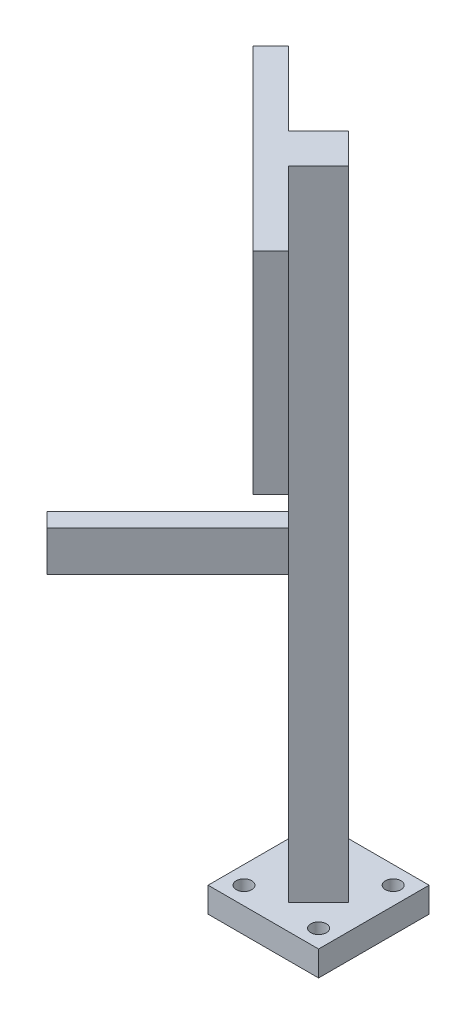
ISO-10303-21;
HEADER;
FILE_DESCRIPTION(('STEP AP214'),'2;1');
FILE_NAME('part.step','',(''),(''),'','','');
FILE_SCHEMA(('AUTOMOTIVE_DESIGN { 1 0 10303 214 1 1 1 1 }'));
ENDSEC;
DATA;
#1=APPLICATION_CONTEXT('core data for automotive mechanical design processes');
#2=APPLICATION_PROTOCOL_DEFINITION('international standard','automotive_design',2000,#1);
#3=PRODUCT_CONTEXT('',#1,'mechanical');
#4=PRODUCT('Part','Part','',(#3));
#5=PRODUCT_RELATED_PRODUCT_CATEGORY('part','',(#4));
#6=PRODUCT_DEFINITION_FORMATION('','',#4);
#7=PRODUCT_DEFINITION_CONTEXT('part definition',#1,'design');
#8=PRODUCT_DEFINITION('design','',#6,#7);
#9=PRODUCT_DEFINITION_SHAPE('','',#8);
#10=(LENGTH_UNIT() NAMED_UNIT(*) SI_UNIT(.MILLI.,.METRE.));
#11=(NAMED_UNIT(*) PLANE_ANGLE_UNIT() SI_UNIT($,.RADIAN.));
#12=(NAMED_UNIT(*) SI_UNIT($,.STERADIAN.) SOLID_ANGLE_UNIT());
#13=UNCERTAINTY_MEASURE_WITH_UNIT(LENGTH_MEASURE(1.E-05),#10,'distance_accuracy_value','');
#14=(GEOMETRIC_REPRESENTATION_CONTEXT(3) GLOBAL_UNCERTAINTY_ASSIGNED_CONTEXT((#13)) GLOBAL_UNIT_ASSIGNED_CONTEXT((#10,
#11,#12)) REPRESENTATION_CONTEXT('',''));
#15=CARTESIAN_POINT('',(0.,0.,0.));
#16=DIRECTION('',(0.,0.,1.));
#17=DIRECTION('',(1.,0.,0.));
#18=AXIS2_PLACEMENT_3D('',#15,#16,#17);
#19=CARTESIAN_POINT('',(-5.99999999999986,132.,0.));
#20=DIRECTION('',(0.70710678118655,0.,-0.707106781186545));
#21=DIRECTION('',(-0.707106781186545,0.,-0.70710678118655));
#22=AXIS2_PLACEMENT_3D('',#19,#20,#21);
#23=PLANE('',#22);
#24=DIRECTION('',(0.,-1.,0.));
#25=VECTOR('',#24,1.);
#26=CARTESIAN_POINT('',(-4.41421356237302,60.,1.58578643762682));
#27=LINE('',#26,#25);
#28=CARTESIAN_POINT('',(-4.41421356237302,68.,1.58578643762682));
#29=VERTEX_POINT('',#28);
#30=CARTESIAN_POINT('',(-4.41421356237302,60.,1.58578643762682));
#31=VERTEX_POINT('',#30);
#32=EDGE_CURVE('E307',#29,#31,#27,.T.);
#33=ORIENTED_EDGE('',*,*,#32,.F.);
#34=DIRECTION('',(-0.707106781186545,0.,-0.70710678118655));
#35=VECTOR('',#34,1.);
#36=CARTESIAN_POINT('',(-4.41421356237302,68.,1.58578643762682));
#37=LINE('',#36,#35);
#38=CARTESIAN_POINT('',(-1.58578643762684,68.,4.41421356237302));
#39=VERTEX_POINT('',#38);
#40=EDGE_CURVE('E312',#39,#29,#37,.T.);
#41=ORIENTED_EDGE('',*,*,#40,.F.);
#42=DIRECTION('',(0.,1.,0.));
#43=VECTOR('',#42,1.);
#44=CARTESIAN_POINT('',(-1.58578643762684,68.,4.41421356237302));
#45=LINE('',#44,#43);
#46=CARTESIAN_POINT('',(-1.58578643762684,60.,4.41421356237302));
#47=VERTEX_POINT('',#46);
#48=EDGE_CURVE('E324',#47,#39,#45,.T.);
#49=ORIENTED_EDGE('',*,*,#48,.F.);
#50=DIRECTION('',(0.707106781186545,0.,0.70710678118655));
#51=VECTOR('',#50,1.);
#52=CARTESIAN_POINT('',(-1.58578643762684,60.,4.41421356237302));
#53=LINE('',#52,#51);
#54=EDGE_CURVE('E321',#31,#47,#53,.T.);
#55=ORIENTED_EDGE('',*,*,#54,.F.);
#56=EDGE_LOOP('',(#33,#41,#49,#55));
#57=FACE_BOUND('',#56,.T.);
#58=DIRECTION('',(0.707106781186545,0.,0.70710678118655));
#59=VECTOR('',#58,1.);
#60=CARTESIAN_POINT('',(14.6776695296637,90.,20.6776695296636));
#61=LINE('',#60,#59);
#62=CARTESIAN_POINT('',(-5.99999999999985,90.,0.));
#63=VERTEX_POINT('',#62);
#64=CARTESIAN_POINT('',(1.28369537222284E-13,90.,6.));
#65=VERTEX_POINT('',#64);
#66=EDGE_CURVE('E292',#63,#65,#61,.T.);
#67=ORIENTED_EDGE('',*,*,#66,.F.);
#68=DIRECTION('',(0.,-1.,0.));
#69=VECTOR('',#68,1.);
#70=CARTESIAN_POINT('',(-5.99999999999986,132.,0.));
#71=LINE('',#70,#69);
#72=CARTESIAN_POINT('',(-5.99999999999986,5.,0.));
#73=VERTEX_POINT('',#72);
#74=EDGE_CURVE('E367',#63,#73,#71,.T.);
#75=ORIENTED_EDGE('',*,*,#74,.T.);
#76=DIRECTION('',(0.707106781186545,0.,0.70710678118655));
#77=VECTOR('',#76,1.);
#78=CARTESIAN_POINT('',(-5.99999999999986,5.,0.));
#79=LINE('',#78,#77);
#80=CARTESIAN_POINT('',(1.23625527121837E-13,5.,6.));
#81=VERTEX_POINT('',#80);
#82=EDGE_CURVE('E356',#73,#81,#79,.T.);
#83=ORIENTED_EDGE('',*,*,#82,.T.);
#84=DIRECTION('',(0.,-1.,0.));
#85=VECTOR('',#84,1.);
#86=CARTESIAN_POINT('',(1.23625527121837E-13,132.,6.));
#87=LINE('',#86,#85);
#88=EDGE_CURVE('E363',#65,#81,#87,.T.);
#89=ORIENTED_EDGE('',*,*,#88,.F.);
#90=EDGE_LOOP('',(#67,#75,#83,#89));
#91=FACE_BOUND('',#90,.T.);
#92=ADVANCED_FACE('F36',(#57,#91),#23,.F.);
#93=CARTESIAN_POINT('',(0.,5.,0.));
#94=DIRECTION('',(0.,1.,0.));
#95=DIRECTION('',(0.,0.,1.));
#96=AXIS2_PLACEMENT_3D('',#93,#94,#95);
#97=PLANE('',#96);
#98=DIRECTION('',(-0.707106781186545,0.,-0.70710678118655));
#99=VECTOR('',#98,1.);
#100=CARTESIAN_POINT('',(6.00000000000014,5.,0.));
#101=LINE('',#100,#99);
#102=CARTESIAN_POINT('',(6.00000000000014,5.,0.));
#103=VERTEX_POINT('',#102);
#104=CARTESIAN_POINT('',(1.65523303187956E-13,5.,-6.));
#105=VERTEX_POINT('',#104);
#106=EDGE_CURVE('E340',#103,#105,#101,.T.);
#107=ORIENTED_EDGE('',*,*,#106,.F.);
#108=DIRECTION('',(0.70710678118655,0.,-0.707106781186545));
#109=VECTOR('',#108,1.);
#110=CARTESIAN_POINT('',(1.23625527121837E-13,5.,6.));
#111=LINE('',#110,#109);
#112=EDGE_CURVE('E345',#81,#103,#111,.T.);
#113=ORIENTED_EDGE('',*,*,#112,.F.);
#114=ORIENTED_EDGE('',*,*,#82,.F.);
#115=DIRECTION('',(-0.70710678118655,0.,0.707106781186545));
#116=VECTOR('',#115,1.);
#117=CARTESIAN_POINT('',(1.65523303187956E-13,5.,-6.));
#118=LINE('',#117,#116);
#119=EDGE_CURVE('E353',#105,#73,#118,.T.);
#120=ORIENTED_EDGE('',*,*,#119,.F.);
#121=EDGE_LOOP('',(#107,#113,#114,#120));
#122=FACE_BOUND('',#121,.T.);
#123=CARTESIAN_POINT('',(7.42462120245917,5.,7.42462120245833));
#124=DIRECTION('',(0.,1.,0.));
#125=DIRECTION('',(0.,0.,1.));
#126=AXIS2_PLACEMENT_3D('',#123,#124,#125);
#127=CIRCLE('',#126,1.55000000000059);
#128=CARTESIAN_POINT('',(7.42462120245917,5.,8.97462120245892));
#129=VERTEX_POINT('',#128);
#130=EDGE_CURVE('E380',#129,#129,#127,.T.);
#131=ORIENTED_EDGE('',*,*,#130,.F.);
#132=EDGE_LOOP('',(#131));
#133=FACE_BOUND('',#132,.T.);
#134=CARTESIAN_POINT('',(-7.42462120245875,5.,-7.42462120245875));
#135=DIRECTION('',(0.,1.,0.));
#136=DIRECTION('',(0.,0.,1.));
#137=AXIS2_PLACEMENT_3D('',#134,#135,#136);
#138=CIRCLE('',#137,1.55);
#139=CARTESIAN_POINT('',(-7.42462120245875,5.,-5.87462120245875));
#140=VERTEX_POINT('',#139);
#141=EDGE_CURVE('E392',#140,#140,#138,.T.);
#142=ORIENTED_EDGE('',*,*,#141,.F.);
#143=EDGE_LOOP('',(#142));
#144=FACE_BOUND('',#143,.T.);
#145=DIRECTION('',(0.,0.,-1.));
#146=VECTOR('',#145,1.);
#147=CARTESIAN_POINT('',(11.,5.,-11.));
#148=LINE('',#147,#146);
#149=CARTESIAN_POINT('',(11.,5.,11.));
#150=VERTEX_POINT('',#149);
#151=CARTESIAN_POINT('',(11.,5.,-11.));
#152=VERTEX_POINT('',#151);
#153=EDGE_CURVE('E398',#150,#152,#148,.T.);
#154=ORIENTED_EDGE('',*,*,#153,.T.);
#155=DIRECTION('',(-1.,0.,0.));
#156=VECTOR('',#155,1.);
#157=CARTESIAN_POINT('',(-11.,5.,-11.));
#158=LINE('',#157,#156);
#159=CARTESIAN_POINT('',(-11.,5.,-11.));
#160=VERTEX_POINT('',#159);
#161=EDGE_CURVE('E401',#152,#160,#158,.T.);
#162=ORIENTED_EDGE('',*,*,#161,.T.);
#163=DIRECTION('',(0.,0.,1.));
#164=VECTOR('',#163,1.);
#165=CARTESIAN_POINT('',(-11.,5.,-11.));
#166=LINE('',#165,#164);
#167=CARTESIAN_POINT('',(-11.,5.,11.));
#168=VERTEX_POINT('',#167);
#169=EDGE_CURVE('E404',#160,#168,#166,.T.);
#170=ORIENTED_EDGE('',*,*,#169,.T.);
#171=DIRECTION('',(1.,0.,0.));
#172=VECTOR('',#171,1.);
#173=CARTESIAN_POINT('',(-11.,5.,11.));
#174=LINE('',#173,#172);
#175=EDGE_CURVE('E406',#168,#150,#174,.T.);
#176=ORIENTED_EDGE('',*,*,#175,.T.);
#177=EDGE_LOOP('',(#154,#162,#170,#176));
#178=FACE_BOUND('',#177,.T.);
#179=CARTESIAN_POINT('',(7.42462120245875,5.,-7.42462120245917));
#180=DIRECTION('',(0.,1.,0.));
#181=DIRECTION('',(0.,0.,1.));
#182=AXIS2_PLACEMENT_3D('',#179,#180,#181);
#183=CIRCLE('',#182,1.55000000000044);
#184=CARTESIAN_POINT('',(7.42462120245875,5.,-5.87462120245873));
#185=VERTEX_POINT('',#184);
#186=EDGE_CURVE('E386',#185,#185,#183,.T.);
#187=ORIENTED_EDGE('',*,*,#186,.F.);
#188=EDGE_LOOP('',(#187));
#189=FACE_BOUND('',#188,.T.);
#190=CARTESIAN_POINT('',(-7.42462120245833,5.,7.42462120245875));
#191=DIRECTION('',(0.,1.,0.));
#192=DIRECTION('',(0.,0.,1.));
#193=AXIS2_PLACEMENT_3D('',#190,#191,#192);
#194=CIRCLE('',#193,1.55000000000023);
#195=CARTESIAN_POINT('',(-7.42462120245833,5.,8.97462120245898));
#196=VERTEX_POINT('',#195);
#197=EDGE_CURVE('E374',#196,#196,#194,.T.);
#198=ORIENTED_EDGE('',*,*,#197,.F.);
#199=EDGE_LOOP('',(#198));
#200=FACE_BOUND('',#199,.T.);
#201=ADVANCED_FACE('F441',(#122,#133,#144,#178,#189,#200),#97,.T.);
#202=CARTESIAN_POINT('',(0.,0.,0.));
#203=DIRECTION('',(0.,1.,0.));
#204=DIRECTION('',(0.,0.,1.));
#205=AXIS2_PLACEMENT_3D('',#202,#203,#204);
#206=PLANE('',#205);
#207=DIRECTION('',(0.,0.,-1.));
#208=VECTOR('',#207,1.);
#209=CARTESIAN_POINT('',(11.,0.,-11.));
#210=LINE('',#209,#208);
#211=CARTESIAN_POINT('',(11.,0.,11.));
#212=VERTEX_POINT('',#211);
#213=CARTESIAN_POINT('',(11.,0.,-11.));
#214=VERTEX_POINT('',#213);
#215=EDGE_CURVE('E395',#212,#214,#210,.T.);
#216=ORIENTED_EDGE('',*,*,#215,.F.);
#217=DIRECTION('',(1.,0.,0.));
#218=VECTOR('',#217,1.);
#219=CARTESIAN_POINT('',(-11.,0.,11.));
#220=LINE('',#219,#218);
#221=CARTESIAN_POINT('',(-11.,0.,11.));
#222=VERTEX_POINT('',#221);
#223=EDGE_CURVE('E402',#222,#212,#220,.T.);
#224=ORIENTED_EDGE('',*,*,#223,.F.);
#225=DIRECTION('',(0.,0.,1.));
#226=VECTOR('',#225,1.);
#227=CARTESIAN_POINT('',(-11.,0.,-11.));
#228=LINE('',#227,#226);
#229=CARTESIAN_POINT('',(-11.,0.,-11.));
#230=VERTEX_POINT('',#229);
#231=EDGE_CURVE('E413',#230,#222,#228,.T.);
#232=ORIENTED_EDGE('',*,*,#231,.F.);
#233=DIRECTION('',(-1.,0.,0.));
#234=VECTOR('',#233,1.);
#235=CARTESIAN_POINT('',(-11.,0.,-11.));
#236=LINE('',#235,#234);
#237=EDGE_CURVE('E411',#214,#230,#236,.T.);
#238=ORIENTED_EDGE('',*,*,#237,.F.);
#239=EDGE_LOOP('',(#216,#224,#232,#238));
#240=FACE_BOUND('',#239,.T.);
#241=CARTESIAN_POINT('',(-7.42462120245875,0.,-7.42462120245875));
#242=DIRECTION('',(0.,1.,0.));
#243=DIRECTION('',(0.,0.,1.));
#244=AXIS2_PLACEMENT_3D('',#241,#242,#243);
#245=CIRCLE('',#244,1.55);
#246=CARTESIAN_POINT('',(-7.42462120245875,0.,-5.87462120245875));
#247=VERTEX_POINT('',#246);
#248=EDGE_CURVE('E389',#247,#247,#245,.T.);
#249=ORIENTED_EDGE('',*,*,#248,.T.);
#250=EDGE_LOOP('',(#249));
#251=FACE_BOUND('',#250,.T.);
#252=CARTESIAN_POINT('',(7.42462120245875,0.,-7.42462120245917));
#253=DIRECTION('',(0.,1.,0.));
#254=DIRECTION('',(0.,0.,1.));
#255=AXIS2_PLACEMENT_3D('',#252,#253,#254);
#256=CIRCLE('',#255,1.55000000000044);
#257=CARTESIAN_POINT('',(7.42462120245875,0.,-5.87462120245873));
#258=VERTEX_POINT('',#257);
#259=EDGE_CURVE('E383',#258,#258,#256,.T.);
#260=ORIENTED_EDGE('',*,*,#259,.T.);
#261=EDGE_LOOP('',(#260));
#262=FACE_BOUND('',#261,.T.);
#263=CARTESIAN_POINT('',(7.42462120245917,0.,7.42462120245833));
#264=DIRECTION('',(0.,1.,0.));
#265=DIRECTION('',(0.,0.,1.));
#266=AXIS2_PLACEMENT_3D('',#263,#264,#265);
#267=CIRCLE('',#266,1.55000000000059);
#268=CARTESIAN_POINT('',(7.42462120245917,0.,8.97462120245892));
#269=VERTEX_POINT('',#268);
#270=EDGE_CURVE('E377',#269,#269,#267,.T.);
#271=ORIENTED_EDGE('',*,*,#270,.T.);
#272=EDGE_LOOP('',(#271));
#273=FACE_BOUND('',#272,.T.);
#274=CARTESIAN_POINT('',(-7.42462120245833,0.,7.42462120245875));
#275=DIRECTION('',(0.,1.,0.));
#276=DIRECTION('',(0.,0.,1.));
#277=AXIS2_PLACEMENT_3D('',#274,#275,#276);
#278=CIRCLE('',#277,1.55000000000023);
#279=CARTESIAN_POINT('',(-7.42462120245833,0.,8.97462120245898));
#280=VERTEX_POINT('',#279);
#281=EDGE_CURVE('E373',#280,#280,#278,.T.);
#282=ORIENTED_EDGE('',*,*,#281,.T.);
#283=EDGE_LOOP('',(#282));
#284=FACE_BOUND('',#283,.T.);
#285=ADVANCED_FACE('F431',(#240,#251,#262,#273,#284),#206,.F.);
#286=CARTESIAN_POINT('',(11.,5.,-11.));
#287=DIRECTION('',(-1.,0.,0.));
#288=DIRECTION('',(0.,0.,1.));
#289=AXIS2_PLACEMENT_3D('',#286,#287,#288);
#290=PLANE('',#289);
#291=ORIENTED_EDGE('',*,*,#215,.T.);
#292=DIRECTION('',(0.,-1.,0.));
#293=VECTOR('',#292,1.);
#294=CARTESIAN_POINT('',(11.,5.,-11.));
#295=LINE('',#294,#293);
#296=EDGE_CURVE('E11',#152,#214,#295,.T.);
#297=ORIENTED_EDGE('',*,*,#296,.F.);
#298=ORIENTED_EDGE('',*,*,#153,.F.);
#299=DIRECTION('',(0.,-1.,0.));
#300=VECTOR('',#299,1.);
#301=CARTESIAN_POINT('',(11.,5.,11.));
#302=LINE('',#301,#300);
#303=EDGE_CURVE('E408',#150,#212,#302,.T.);
#304=ORIENTED_EDGE('',*,*,#303,.T.);
#305=EDGE_LOOP('',(#291,#297,#298,#304));
#306=FACE_BOUND('',#305,.T.);
#307=ADVANCED_FACE('F38',(#306),#290,.F.);
#308=CARTESIAN_POINT('',(-11.,5.,-11.));
#309=DIRECTION('',(0.,0.,1.));
#310=DIRECTION('',(1.,0.,0.));
#311=AXIS2_PLACEMENT_3D('',#308,#309,#310);
#312=PLANE('',#311);
#313=ORIENTED_EDGE('',*,*,#237,.T.);
#314=DIRECTION('',(0.,-1.,0.));
#315=VECTOR('',#314,1.);
#316=CARTESIAN_POINT('',(-11.,5.,-11.));
#317=LINE('',#316,#315);
#318=EDGE_CURVE('E44',#160,#230,#317,.T.);
#319=ORIENTED_EDGE('',*,*,#318,.F.);
#320=ORIENTED_EDGE('',*,*,#161,.F.);
#321=ORIENTED_EDGE('',*,*,#296,.T.);
#322=EDGE_LOOP('',(#313,#319,#320,#321));
#323=FACE_BOUND('',#322,.T.);
#324=ADVANCED_FACE('F443',(#323),#312,.F.);
#325=CARTESIAN_POINT('',(-11.,5.,-11.));
#326=DIRECTION('',(1.,0.,0.));
#327=DIRECTION('',(0.,0.,-1.));
#328=AXIS2_PLACEMENT_3D('',#325,#326,#327);
#329=PLANE('',#328);
#330=ORIENTED_EDGE('',*,*,#231,.T.);
#331=DIRECTION('',(0.,-1.,0.));
#332=VECTOR('',#331,1.);
#333=CARTESIAN_POINT('',(-11.,5.,11.));
#334=LINE('',#333,#332);
#335=EDGE_CURVE('E418',#168,#222,#334,.T.);
#336=ORIENTED_EDGE('',*,*,#335,.F.);
#337=ORIENTED_EDGE('',*,*,#169,.F.);
#338=ORIENTED_EDGE('',*,*,#318,.T.);
#339=EDGE_LOOP('',(#330,#336,#337,#338));
#340=FACE_BOUND('',#339,.T.);
#341=ADVANCED_FACE('F425',(#340),#329,.F.);
#342=CARTESIAN_POINT('',(-11.,5.,11.));
#343=DIRECTION('',(0.,0.,-1.));
#344=DIRECTION('',(-1.,0.,0.));
#345=AXIS2_PLACEMENT_3D('',#342,#343,#344);
#346=PLANE('',#345);
#347=ORIENTED_EDGE('',*,*,#223,.T.);
#348=ORIENTED_EDGE('',*,*,#303,.F.);
#349=ORIENTED_EDGE('',*,*,#175,.F.);
#350=ORIENTED_EDGE('',*,*,#335,.T.);
#351=EDGE_LOOP('',(#347,#348,#349,#350));
#352=FACE_BOUND('',#351,.T.);
#353=ADVANCED_FACE('F435',(#352),#346,.F.);
#354=CARTESIAN_POINT('',(-7.42462120245875,5.,-7.42462120245875));
#355=DIRECTION('',(0.,-1.,0.));
#356=DIRECTION('',(0.,0.,-1.));
#357=AXIS2_PLACEMENT_3D('',#354,#355,#356);
#358=CYLINDRICAL_SURFACE('',#357,1.55);
#359=ORIENTED_EDGE('',*,*,#141,.T.);
#360=EDGE_LOOP('',(#359));
#361=FACE_BOUND('',#360,.T.);
#362=ORIENTED_EDGE('',*,*,#248,.F.);
#363=EDGE_LOOP('',(#362));
#364=FACE_BOUND('',#363,.T.);
#365=ADVANCED_FACE('F482',(#361,#364),#358,.F.);
#366=CARTESIAN_POINT('',(7.42462120245875,5.,-7.42462120245917));
#367=DIRECTION('',(0.,-1.,0.));
#368=DIRECTION('',(0.,0.,-1.));
#369=AXIS2_PLACEMENT_3D('',#366,#367,#368);
#370=CYLINDRICAL_SURFACE('',#369,1.55000000000044);
#371=ORIENTED_EDGE('',*,*,#186,.T.);
#372=EDGE_LOOP('',(#371));
#373=FACE_BOUND('',#372,.T.);
#374=ORIENTED_EDGE('',*,*,#259,.F.);
#375=EDGE_LOOP('',(#374));
#376=FACE_BOUND('',#375,.T.);
#377=ADVANCED_FACE('F478',(#373,#376),#370,.F.);
#378=CARTESIAN_POINT('',(7.42462120245917,5.,7.42462120245833));
#379=DIRECTION('',(0.,-1.,0.));
#380=DIRECTION('',(0.,0.,-1.));
#381=AXIS2_PLACEMENT_3D('',#378,#379,#380);
#382=CYLINDRICAL_SURFACE('',#381,1.55000000000059);
#383=ORIENTED_EDGE('',*,*,#130,.T.);
#384=EDGE_LOOP('',(#383));
#385=FACE_BOUND('',#384,.T.);
#386=ORIENTED_EDGE('',*,*,#270,.F.);
#387=EDGE_LOOP('',(#386));
#388=FACE_BOUND('',#387,.T.);
#389=ADVANCED_FACE('F474',(#385,#388),#382,.F.);
#390=CARTESIAN_POINT('',(-7.42462120245833,5.,7.42462120245875));
#391=DIRECTION('',(0.,-1.,0.));
#392=DIRECTION('',(0.,0.,-1.));
#393=AXIS2_PLACEMENT_3D('',#390,#391,#392);
#394=CYLINDRICAL_SURFACE('',#393,1.55000000000023);
#395=ORIENTED_EDGE('',*,*,#197,.T.);
#396=EDGE_LOOP('',(#395));
#397=FACE_BOUND('',#396,.T.);
#398=ORIENTED_EDGE('',*,*,#281,.F.);
#399=EDGE_LOOP('',(#398));
#400=FACE_BOUND('',#399,.T.);
#401=ADVANCED_FACE('F470',(#397,#400),#394,.F.);
#402=CARTESIAN_POINT('',(6.00000000000014,132.,0.));
#403=DIRECTION('',(-0.70710678118655,0.,0.707106781186545));
#404=DIRECTION('',(0.707106781186545,0.,0.70710678118655));
#405=AXIS2_PLACEMENT_3D('',#402,#403,#404);
#406=PLANE('',#405);
#407=ORIENTED_EDGE('',*,*,#106,.T.);
#408=DIRECTION('',(0.,-1.,0.));
#409=VECTOR('',#408,1.);
#410=CARTESIAN_POINT('',(1.65523303187956E-13,132.,-6.));
#411=LINE('',#410,#409);
#412=CARTESIAN_POINT('',(1.65523303187956E-13,132.,-6.));
#413=VERTEX_POINT('',#412);
#414=EDGE_CURVE('E370',#413,#105,#411,.T.);
#415=ORIENTED_EDGE('',*,*,#414,.F.);
#416=DIRECTION('',(-0.707106781186545,0.,-0.70710678118655));
#417=VECTOR('',#416,1.);
#418=CARTESIAN_POINT('',(6.00000000000014,132.,0.));
#419=LINE('',#418,#417);
#420=CARTESIAN_POINT('',(6.00000000000014,132.,0.));
#421=VERTEX_POINT('',#420);
#422=EDGE_CURVE('E341',#421,#413,#419,.T.);
#423=ORIENTED_EDGE('',*,*,#422,.F.);
#424=DIRECTION('',(0.,-1.,0.));
#425=VECTOR('',#424,1.);
#426=CARTESIAN_POINT('',(6.00000000000014,132.,0.));
#427=LINE('',#426,#425);
#428=EDGE_CURVE('E350',#421,#103,#427,.T.);
#429=ORIENTED_EDGE('',*,*,#428,.T.);
#430=EDGE_LOOP('',(#407,#415,#423,#429));
#431=FACE_BOUND('',#430,.T.);
#432=ADVANCED_FACE('F466',(#431),#406,.F.);
#433=CARTESIAN_POINT('',(1.65523303187956E-13,132.,-6.));
#434=DIRECTION('',(0.707106781186545,0.,0.70710678118655));
#435=DIRECTION('',(0.70710678118655,0.,-0.707106781186545));
#436=AXIS2_PLACEMENT_3D('',#433,#434,#435);
#437=PLANE('',#436);
#438=ORIENTED_EDGE('',*,*,#119,.T.);
#439=ORIENTED_EDGE('',*,*,#74,.F.);
#440=CARTESIAN_POINT('',(-5.99999999999986,132.,0.));
#441=VERTEX_POINT('',#440);
#442=EDGE_CURVE('E368',#441,#63,#71,.T.);
#443=ORIENTED_EDGE('',*,*,#442,.F.);
#444=DIRECTION('',(-0.70710678118655,0.,0.707106781186545));
#445=VECTOR('',#444,1.);
#446=CARTESIAN_POINT('',(1.65523303187956E-13,132.,-6.));
#447=LINE('',#446,#445);
#448=EDGE_CURVE('E344',#413,#441,#447,.T.);
#449=ORIENTED_EDGE('',*,*,#448,.F.);
#450=ORIENTED_EDGE('',*,*,#414,.T.);
#451=EDGE_LOOP('',(#438,#439,#443,#449,#450));
#452=FACE_BOUND('',#451,.T.);
#453=ADVANCED_FACE('F463',(#452),#437,.F.);
#454=CARTESIAN_POINT('',(1.23625527121837E-13,132.,6.));
#455=DIRECTION('',(-0.707106781186545,0.,-0.70710678118655));
#456=DIRECTION('',(-0.70710678118655,0.,0.707106781186545));
#457=AXIS2_PLACEMENT_3D('',#454,#455,#456);
#458=PLANE('',#457);
#459=ORIENTED_EDGE('',*,*,#112,.T.);
#460=ORIENTED_EDGE('',*,*,#428,.F.);
#461=DIRECTION('',(0.70710678118655,0.,-0.707106781186545));
#462=VECTOR('',#461,1.);
#463=CARTESIAN_POINT('',(1.23625527121837E-13,132.,6.));
#464=LINE('',#463,#462);
#465=CARTESIAN_POINT('',(1.23625527121837E-13,132.,6.));
#466=VERTEX_POINT('',#465);
#467=EDGE_CURVE('E348',#466,#421,#464,.T.);
#468=ORIENTED_EDGE('',*,*,#467,.F.);
#469=EDGE_CURVE('E364',#466,#65,#87,.T.);
#470=ORIENTED_EDGE('',*,*,#469,.T.);
#471=ORIENTED_EDGE('',*,*,#88,.T.);
#472=EDGE_LOOP('',(#459,#460,#468,#470,#471));
#473=FACE_BOUND('',#472,.T.);
#474=ADVANCED_FACE('F461',(#473),#458,.F.);
#475=CARTESIAN_POINT('',(0.,132.,0.));
#476=DIRECTION('',(0.,1.,0.));
#477=DIRECTION('',(0.,0.,1.));
#478=AXIS2_PLACEMENT_3D('',#475,#476,#477);
#479=PLANE('',#478);
#480=ORIENTED_EDGE('',*,*,#422,.T.);
#481=ORIENTED_EDGE('',*,*,#448,.T.);
#482=DIRECTION('',(-0.707106781186545,0.,-0.70710678118655));
#483=VECTOR('',#482,1.);
#484=CARTESIAN_POINT('',(1.24466409401336E-13,132.,6.));
#485=LINE('',#484,#483);
#486=CARTESIAN_POINT('',(-20.6776695296636,132.,-14.6776695296638));
#487=VERTEX_POINT('',#486);
#488=EDGE_CURVE('E294',#441,#487,#485,.T.);
#489=ORIENTED_EDGE('',*,*,#488,.T.);
#490=DIRECTION('',(0.70710678118655,0.,-0.707106781186545));
#491=VECTOR('',#490,1.);
#492=CARTESIAN_POINT('',(-24.2132034355963,132.,-11.1421356237311));
#493=LINE('',#492,#491);
#494=CARTESIAN_POINT('',(-24.2132034355963,132.,-11.1421356237311));
#495=VERTEX_POINT('',#494);
#496=EDGE_CURVE('E304',#495,#487,#493,.T.);
#497=ORIENTED_EDGE('',*,*,#496,.F.);
#498=DIRECTION('',(-0.707106781186545,0.,-0.70710678118655));
#499=VECTOR('',#498,1.);
#500=CARTESIAN_POINT('',(-24.2132034355963,132.,-11.1421356237311));
#501=LINE('',#500,#499);
#502=CARTESIAN_POINT('',(11.1421356237309,132.,24.2132034355964));
#503=VERTEX_POINT('',#502);
#504=EDGE_CURVE('E274',#503,#495,#501,.T.);
#505=ORIENTED_EDGE('',*,*,#504,.F.);
#506=DIRECTION('',(0.70710678118655,0.,-0.707106781186545));
#507=VECTOR('',#506,1.);
#508=CARTESIAN_POINT('',(11.1421356237309,132.,24.2132034355964));
#509=LINE('',#508,#507);
#510=CARTESIAN_POINT('',(14.6776695296637,132.,20.6776695296637));
#511=VERTEX_POINT('',#510);
#512=EDGE_CURVE('E285',#503,#511,#509,.T.);
#513=ORIENTED_EDGE('',*,*,#512,.T.);
#514=EDGE_CURVE('E278',#511,#466,#485,.T.);
#515=ORIENTED_EDGE('',*,*,#514,.T.);
#516=ORIENTED_EDGE('',*,*,#467,.T.);
#517=EDGE_LOOP('',(#480,#481,#489,#497,#505,#513,#515,#516));
#518=FACE_BOUND('',#517,.T.);
#519=ADVANCED_FACE('F526',(#518),#479,.T.);
#520=CARTESIAN_POINT('',(-28.4558441227157,60.,25.6274169979694));
#521=DIRECTION('',(0.707106781186545,0.,0.70710678118655));
#522=DIRECTION('',(0.70710678118655,0.,-0.707106781186545));
#523=AXIS2_PLACEMENT_3D('',#520,#521,#522);
#524=PLANE('',#523);
#525=ORIENTED_EDGE('',*,*,#32,.T.);
#526=DIRECTION('',(0.70710678118655,0.,-0.707106781186545));
#527=VECTOR('',#526,1.);
#528=CARTESIAN_POINT('',(-28.4558441227157,60.,25.6274169979694));
#529=LINE('',#528,#527);
#530=CARTESIAN_POINT('',(-28.4558441227157,60.,25.6274169979694));
#531=VERTEX_POINT('',#530);
#532=EDGE_CURVE('E337',#531,#31,#529,.T.);
#533=ORIENTED_EDGE('',*,*,#532,.F.);
#534=DIRECTION('',(0.,-1.,0.));
#535=VECTOR('',#534,1.);
#536=CARTESIAN_POINT('',(-28.4558441227157,60.,25.6274169979694));
#537=LINE('',#536,#535);
#538=CARTESIAN_POINT('',(-28.4558441227157,68.,25.6274169979694));
#539=VERTEX_POINT('',#538);
#540=EDGE_CURVE('E308',#539,#531,#537,.T.);
#541=ORIENTED_EDGE('',*,*,#540,.F.);
#542=DIRECTION('',(0.70710678118655,0.,-0.707106781186545));
#543=VECTOR('',#542,1.);
#544=CARTESIAN_POINT('',(-28.4558441227157,68.,25.6274169979694));
#545=LINE('',#544,#543);
#546=EDGE_CURVE('E318',#539,#29,#545,.T.);
#547=ORIENTED_EDGE('',*,*,#546,.T.);
#548=EDGE_LOOP('',(#525,#533,#541,#547));
#549=FACE_BOUND('',#548,.T.);
#550=ADVANCED_FACE('F533',(#549),#524,.F.);
#551=CARTESIAN_POINT('',(-25.6274169979695,60.,28.4558441227156));
#552=DIRECTION('',(0.,1.,0.));
#553=DIRECTION('',(0.,0.,1.));
#554=AXIS2_PLACEMENT_3D('',#551,#552,#553);
#555=PLANE('',#554);
#556=ORIENTED_EDGE('',*,*,#54,.T.);
#557=DIRECTION('',(0.70710678118655,0.,-0.707106781186545));
#558=VECTOR('',#557,1.);
#559=CARTESIAN_POINT('',(-25.6274169979695,60.,28.4558441227156));
#560=LINE('',#559,#558);
#561=CARTESIAN_POINT('',(-25.6274169979695,60.,28.4558441227156));
#562=VERTEX_POINT('',#561);
#563=EDGE_CURVE('E334',#562,#47,#560,.T.);
#564=ORIENTED_EDGE('',*,*,#563,.F.);
#565=DIRECTION('',(0.707106781186545,0.,0.70710678118655));
#566=VECTOR('',#565,1.);
#567=CARTESIAN_POINT('',(-25.6274169979695,60.,28.4558441227156));
#568=LINE('',#567,#566);
#569=EDGE_CURVE('E311',#531,#562,#568,.T.);
#570=ORIENTED_EDGE('',*,*,#569,.F.);
#571=ORIENTED_EDGE('',*,*,#532,.T.);
#572=EDGE_LOOP('',(#556,#564,#570,#571));
#573=FACE_BOUND('',#572,.T.);
#574=ADVANCED_FACE('F540',(#573),#555,.F.);
#575=CARTESIAN_POINT('',(-25.6274169979695,68.,28.4558441227156));
#576=DIRECTION('',(-0.707106781186545,0.,-0.70710678118655));
#577=DIRECTION('',(-0.70710678118655,0.,0.707106781186545));
#578=AXIS2_PLACEMENT_3D('',#575,#576,#577);
#579=PLANE('',#578);
#580=ORIENTED_EDGE('',*,*,#48,.T.);
#581=DIRECTION('',(0.70710678118655,0.,-0.707106781186545));
#582=VECTOR('',#581,1.);
#583=CARTESIAN_POINT('',(-25.6274169979695,68.,28.4558441227156));
#584=LINE('',#583,#582);
#585=CARTESIAN_POINT('',(-25.6274169979695,68.,28.4558441227156));
#586=VERTEX_POINT('',#585);
#587=EDGE_CURVE('E331',#586,#39,#584,.T.);
#588=ORIENTED_EDGE('',*,*,#587,.F.);
#589=DIRECTION('',(0.,1.,0.));
#590=VECTOR('',#589,1.);
#591=CARTESIAN_POINT('',(-25.6274169979695,68.,28.4558441227156));
#592=LINE('',#591,#590);
#593=EDGE_CURVE('E314',#562,#586,#592,.T.);
#594=ORIENTED_EDGE('',*,*,#593,.F.);
#595=ORIENTED_EDGE('',*,*,#563,.T.);
#596=EDGE_LOOP('',(#580,#588,#594,#595));
#597=FACE_BOUND('',#596,.T.);
#598=ADVANCED_FACE('F548',(#597),#579,.F.);
#599=CARTESIAN_POINT('',(-28.4558441227157,68.,25.6274169979694));
#600=DIRECTION('',(0.,-1.,0.));
#601=DIRECTION('',(0.,0.,-1.));
#602=AXIS2_PLACEMENT_3D('',#599,#600,#601);
#603=PLANE('',#602);
#604=ORIENTED_EDGE('',*,*,#40,.T.);
#605=ORIENTED_EDGE('',*,*,#546,.F.);
#606=DIRECTION('',(-0.707106781186545,0.,-0.70710678118655));
#607=VECTOR('',#606,1.);
#608=CARTESIAN_POINT('',(-28.4558441227157,68.,25.6274169979694));
#609=LINE('',#608,#607);
#610=EDGE_CURVE('E316',#586,#539,#609,.T.);
#611=ORIENTED_EDGE('',*,*,#610,.F.);
#612=ORIENTED_EDGE('',*,*,#587,.T.);
#613=EDGE_LOOP('',(#604,#605,#611,#612));
#614=FACE_BOUND('',#613,.T.);
#615=ADVANCED_FACE('F556',(#614),#603,.F.);
#616=CARTESIAN_POINT('',(-27.0416305603426,0.,27.0416305603425));
#617=DIRECTION('',(0.70710678118655,0.,-0.707106781186545));
#618=DIRECTION('',(-0.707106781186545,0.,-0.70710678118655));
#619=AXIS2_PLACEMENT_3D('',#616,#617,#618);
#620=PLANE('',#619);
#621=ORIENTED_EDGE('',*,*,#540,.T.);
#622=ORIENTED_EDGE('',*,*,#569,.T.);
#623=ORIENTED_EDGE('',*,*,#593,.T.);
#624=ORIENTED_EDGE('',*,*,#610,.T.);
#625=EDGE_LOOP('',(#621,#622,#623,#624));
#626=FACE_BOUND('',#625,.T.);
#627=ADVANCED_FACE('F564',(#626),#620,.F.);
#628=CARTESIAN_POINT('',(-2.99999999999994,0.,2.99999999999992));
#629=DIRECTION('',(0.70710678118655,0.,-0.707106781186545));
#630=DIRECTION('',(-0.707106781186545,0.,-0.70710678118655));
#631=AXIS2_PLACEMENT_3D('',#628,#629,#630);
#632=PLANE('',#631);
#633=DIRECTION('',(0.707106781186546,0.,0.707106781186549));
#634=VECTOR('',#633,1.);
#635=CARTESIAN_POINT('',(-12.3196673760386,91.,-6.31966737603881));
#636=LINE('',#635,#634);
#637=CARTESIAN_POINT('',(-14.5116983977169,91.,-8.51169839771711));
#638=VERTEX_POINT('',#637);
#639=CARTESIAN_POINT('',(-12.3196673760386,91.,-6.31966737603881));
#640=VERTEX_POINT('',#639);
#641=EDGE_CURVE('E207',#638,#640,#636,.T.);
#642=ORIENTED_EDGE('',*,*,#641,.T.);
#643=DIRECTION('',(0.,1.,0.));
#644=VECTOR('',#643,1.);
#645=CARTESIAN_POINT('',(-12.3196673760386,131.,-6.31966737603881));
#646=LINE('',#645,#644);
#647=CARTESIAN_POINT('',(-12.3196673760386,131.,-6.31966737603882));
#648=VERTEX_POINT('',#647);
#649=EDGE_CURVE('E218',#640,#648,#646,.T.);
#650=ORIENTED_EDGE('',*,*,#649,.T.);
#651=DIRECTION('',(-0.707106781186544,0.,-0.707106781186551));
#652=VECTOR('',#651,1.);
#653=CARTESIAN_POINT('',(-14.5116983977169,131.,-8.51169839771711));
#654=LINE('',#653,#652);
#655=CARTESIAN_POINT('',(-14.5116983977169,131.,-8.51169839771711));
#656=VERTEX_POINT('',#655);
#657=EDGE_CURVE('E51',#648,#656,#654,.T.);
#658=ORIENTED_EDGE('',*,*,#657,.T.);
#659=DIRECTION('',(0.,-1.,0.));
#660=VECTOR('',#659,1.);
#661=CARTESIAN_POINT('',(-14.5116983977169,91.,-8.51169839771711));
#662=LINE('',#661,#660);
#663=EDGE_CURVE('E215',#656,#638,#662,.T.);
#664=ORIENTED_EDGE('',*,*,#663,.T.);
#665=EDGE_LOOP('',(#642,#650,#658,#664));
#666=FACE_BOUND('',#665,.T.);
#667=ORIENTED_EDGE('',*,*,#442,.T.);
#668=CARTESIAN_POINT('',(-20.6776695296636,90.,-14.6776695296638));
#669=VERTEX_POINT('',#668);
#670=EDGE_CURVE('E288',#669,#63,#61,.T.);
#671=ORIENTED_EDGE('',*,*,#670,.F.);
#672=DIRECTION('',(0.,-1.,0.));
#673=VECTOR('',#672,1.);
#674=CARTESIAN_POINT('',(-20.6776695296636,90.,-14.6776695296638));
#675=LINE('',#674,#673);
#676=EDGE_CURVE('E241',#487,#669,#675,.T.);
#677=ORIENTED_EDGE('',*,*,#676,.F.);
#678=ORIENTED_EDGE('',*,*,#488,.F.);
#679=EDGE_LOOP('',(#667,#671,#677,#678));
#680=FACE_BOUND('',#679,.T.);
#681=ADVANCED_FACE('F222',(#666,#680),#632,.T.);
#682=DIRECTION('',(0.707106781186546,0.,0.707106781186549));
#683=VECTOR('',#682,1.);
#684=CARTESIAN_POINT('',(8.51169839771701,91.,14.5116983977169));
#685=LINE('',#684,#683);
#686=CARTESIAN_POINT('',(6.31966737603873,91.,12.3196673760386));
#687=VERTEX_POINT('',#686);
#688=CARTESIAN_POINT('',(8.51169839771701,91.,14.5116983977169));
#689=VERTEX_POINT('',#688);
#690=EDGE_CURVE('E245',#687,#689,#685,.T.);
#691=ORIENTED_EDGE('',*,*,#690,.T.);
#692=DIRECTION('',(0.,1.,0.));
#693=VECTOR('',#692,1.);
#694=CARTESIAN_POINT('',(8.51169839771701,131.,14.5116983977169));
#695=LINE('',#694,#693);
#696=CARTESIAN_POINT('',(8.51169839771702,131.,14.5116983977169));
#697=VERTEX_POINT('',#696);
#698=EDGE_CURVE('E248',#689,#697,#695,.T.);
#699=ORIENTED_EDGE('',*,*,#698,.T.);
#700=DIRECTION('',(-0.707106781186544,0.,-0.707106781186551));
#701=VECTOR('',#700,1.);
#702=CARTESIAN_POINT('',(6.31966737603873,131.,12.3196673760386));
#703=LINE('',#702,#701);
#704=CARTESIAN_POINT('',(6.31966737603873,131.,12.3196673760386));
#705=VERTEX_POINT('',#704);
#706=EDGE_CURVE('E59',#697,#705,#703,.T.);
#707=ORIENTED_EDGE('',*,*,#706,.T.);
#708=DIRECTION('',(0.,-1.,0.));
#709=VECTOR('',#708,1.);
#710=CARTESIAN_POINT('',(6.31966737603873,91.,12.3196673760386));
#711=LINE('',#710,#709);
#712=EDGE_CURVE('E253',#705,#687,#711,.T.);
#713=ORIENTED_EDGE('',*,*,#712,.T.);
#714=EDGE_LOOP('',(#691,#699,#707,#713));
#715=FACE_BOUND('',#714,.T.);
#716=ORIENTED_EDGE('',*,*,#469,.F.);
#717=ORIENTED_EDGE('',*,*,#514,.F.);
#718=DIRECTION('',(0.,1.,0.));
#719=VECTOR('',#718,1.);
#720=CARTESIAN_POINT('',(14.6776695296637,132.,20.6776695296637));
#721=LINE('',#720,#719);
#722=CARTESIAN_POINT('',(14.6776695296637,90.,20.6776695296636));
#723=VERTEX_POINT('',#722);
#724=EDGE_CURVE('E291',#723,#511,#721,.T.);
#725=ORIENTED_EDGE('',*,*,#724,.F.);
#726=EDGE_CURVE('E287',#65,#723,#61,.T.);
#727=ORIENTED_EDGE('',*,*,#726,.F.);
#728=EDGE_LOOP('',(#716,#717,#725,#727));
#729=FACE_BOUND('',#728,.T.);
#730=ADVANCED_FACE('F579',(#715,#729),#632,.T.);
#731=CARTESIAN_POINT('',(-24.2132034355963,90.,-11.1421356237311));
#732=DIRECTION('',(0.707106781186545,0.,0.70710678118655));
#733=DIRECTION('',(0.70710678118655,0.,-0.707106781186545));
#734=AXIS2_PLACEMENT_3D('',#731,#732,#733);
#735=PLANE('',#734);
#736=ORIENTED_EDGE('',*,*,#676,.T.);
#737=DIRECTION('',(0.70710678118655,0.,-0.707106781186545));
#738=VECTOR('',#737,1.);
#739=CARTESIAN_POINT('',(-24.2132034355963,90.,-11.1421356237311));
#740=LINE('',#739,#738);
#741=CARTESIAN_POINT('',(-24.2132034355963,90.,-11.1421356237311));
#742=VERTEX_POINT('',#741);
#743=EDGE_CURVE('E301',#742,#669,#740,.T.);
#744=ORIENTED_EDGE('',*,*,#743,.F.);
#745=DIRECTION('',(0.,-1.,0.));
#746=VECTOR('',#745,1.);
#747=CARTESIAN_POINT('',(-24.2132034355963,90.,-11.1421356237311));
#748=LINE('',#747,#746);
#749=EDGE_CURVE('E277',#495,#742,#748,.T.);
#750=ORIENTED_EDGE('',*,*,#749,.F.);
#751=ORIENTED_EDGE('',*,*,#496,.T.);
#752=EDGE_LOOP('',(#736,#744,#750,#751));
#753=FACE_BOUND('',#752,.T.);
#754=ADVANCED_FACE('F587',(#753),#735,.F.);
#755=CARTESIAN_POINT('',(11.1421356237309,90.,24.2132034355964));
#756=DIRECTION('',(0.,1.,0.));
#757=DIRECTION('',(0.,0.,1.));
#758=AXIS2_PLACEMENT_3D('',#755,#756,#757);
#759=PLANE('',#758);
#760=ORIENTED_EDGE('',*,*,#670,.T.);
#761=ORIENTED_EDGE('',*,*,#66,.T.);
#762=ORIENTED_EDGE('',*,*,#726,.T.);
#763=DIRECTION('',(0.70710678118655,0.,-0.707106781186545));
#764=VECTOR('',#763,1.);
#765=CARTESIAN_POINT('',(11.1421356237309,90.,24.2132034355964));
#766=LINE('',#765,#764);
#767=CARTESIAN_POINT('',(11.1421356237309,90.,24.2132034355964));
#768=VERTEX_POINT('',#767);
#769=EDGE_CURVE('E298',#768,#723,#766,.T.);
#770=ORIENTED_EDGE('',*,*,#769,.F.);
#771=DIRECTION('',(0.707106781186545,0.,0.70710678118655));
#772=VECTOR('',#771,1.);
#773=CARTESIAN_POINT('',(11.1421356237309,90.,24.2132034355964));
#774=LINE('',#773,#772);
#775=EDGE_CURVE('E280',#742,#768,#774,.T.);
#776=ORIENTED_EDGE('',*,*,#775,.F.);
#777=ORIENTED_EDGE('',*,*,#743,.T.);
#778=EDGE_LOOP('',(#760,#761,#762,#770,#776,#777));
#779=FACE_BOUND('',#778,.T.);
#780=ADVANCED_FACE('F594',(#779),#759,.F.);
#781=CARTESIAN_POINT('',(11.1421356237309,132.,24.2132034355964));
#782=DIRECTION('',(-0.707106781186545,0.,-0.70710678118655));
#783=DIRECTION('',(-0.70710678118655,0.,0.707106781186545));
#784=AXIS2_PLACEMENT_3D('',#781,#782,#783);
#785=PLANE('',#784);
#786=ORIENTED_EDGE('',*,*,#724,.T.);
#787=ORIENTED_EDGE('',*,*,#512,.F.);
#788=DIRECTION('',(0.,1.,0.));
#789=VECTOR('',#788,1.);
#790=CARTESIAN_POINT('',(11.1421356237309,132.,24.2132034355964));
#791=LINE('',#790,#789);
#792=EDGE_CURVE('E282',#768,#503,#791,.T.);
#793=ORIENTED_EDGE('',*,*,#792,.F.);
#794=ORIENTED_EDGE('',*,*,#769,.T.);
#795=EDGE_LOOP('',(#786,#787,#793,#794));
#796=FACE_BOUND('',#795,.T.);
#797=ADVANCED_FACE('F602',(#796),#785,.F.);
#798=CARTESIAN_POINT('',(-6.53553390593269,0.,6.53553390593265));
#799=DIRECTION('',(0.70710678118655,0.,-0.707106781186545));
#800=DIRECTION('',(-0.707106781186545,0.,-0.70710678118655));
#801=AXIS2_PLACEMENT_3D('',#798,#799,#800);
#802=PLANE('',#801);
#803=DIRECTION('',(0.,1.,0.));
#804=VECTOR('',#803,1.);
#805=CARTESIAN_POINT('',(-15.8552012819714,131.,-2.78413347010608));
#806=LINE('',#805,#804);
#807=CARTESIAN_POINT('',(-15.8552012819713,91.,-2.78413347010608));
#808=VERTEX_POINT('',#807);
#809=CARTESIAN_POINT('',(-15.8552012819714,131.,-2.78413347010608));
#810=VERTEX_POINT('',#809);
#811=EDGE_CURVE('E234',#808,#810,#806,.T.);
#812=ORIENTED_EDGE('',*,*,#811,.F.);
#813=DIRECTION('',(0.707106781186546,0.,0.707106781186549));
#814=VECTOR('',#813,1.);
#815=CARTESIAN_POINT('',(-15.8552012819714,91.,-2.78413347010608));
#816=LINE('',#815,#814);
#817=CARTESIAN_POINT('',(-18.0472323036497,91.,-4.97616449178438));
#818=VERTEX_POINT('',#817);
#819=EDGE_CURVE('E210',#818,#808,#816,.T.);
#820=ORIENTED_EDGE('',*,*,#819,.F.);
#821=DIRECTION('',(0.,-1.,0.));
#822=VECTOR('',#821,1.);
#823=CARTESIAN_POINT('',(-18.0472323036497,91.,-4.97616449178438));
#824=LINE('',#823,#822);
#825=CARTESIAN_POINT('',(-18.0472323036496,131.,-4.97616449178438));
#826=VERTEX_POINT('',#825);
#827=EDGE_CURVE('E225',#826,#818,#824,.T.);
#828=ORIENTED_EDGE('',*,*,#827,.F.);
#829=DIRECTION('',(-0.707106781186544,0.,-0.707106781186551));
#830=VECTOR('',#829,1.);
#831=CARTESIAN_POINT('',(-18.0472323036496,131.,-4.97616449178438));
#832=LINE('',#831,#830);
#833=EDGE_CURVE('E228',#810,#826,#832,.T.);
#834=ORIENTED_EDGE('',*,*,#833,.F.);
#835=EDGE_LOOP('',(#812,#820,#828,#834));
#836=FACE_BOUND('',#835,.T.);
#837=DIRECTION('',(0.,1.,0.));
#838=VECTOR('',#837,1.);
#839=CARTESIAN_POINT('',(4.97616449178426,131.,18.0472323036497));
#840=LINE('',#839,#838);
#841=CARTESIAN_POINT('',(4.97616449178427,91.,18.0472323036497));
#842=VERTEX_POINT('',#841);
#843=CARTESIAN_POINT('',(4.97616449178426,131.,18.0472323036497));
#844=VERTEX_POINT('',#843);
#845=EDGE_CURVE('E259',#842,#844,#840,.T.);
#846=ORIENTED_EDGE('',*,*,#845,.F.);
#847=DIRECTION('',(0.707106781186546,0.,0.707106781186549));
#848=VECTOR('',#847,1.);
#849=CARTESIAN_POINT('',(4.97616449178426,91.,18.0472323036497));
#850=LINE('',#849,#848);
#851=CARTESIAN_POINT('',(2.78413347010598,91.,15.8552012819714));
#852=VERTEX_POINT('',#851);
#853=EDGE_CURVE('E257',#852,#842,#850,.T.);
#854=ORIENTED_EDGE('',*,*,#853,.F.);
#855=DIRECTION('',(0.,-1.,0.));
#856=VECTOR('',#855,1.);
#857=CARTESIAN_POINT('',(2.78413347010598,91.,15.8552012819714));
#858=LINE('',#857,#856);
#859=CARTESIAN_POINT('',(2.78413347010598,131.,15.8552012819714));
#860=VERTEX_POINT('',#859);
#861=EDGE_CURVE('E249',#860,#852,#858,.T.);
#862=ORIENTED_EDGE('',*,*,#861,.F.);
#863=DIRECTION('',(-0.707106781186544,0.,-0.707106781186551));
#864=VECTOR('',#863,1.);
#865=CARTESIAN_POINT('',(2.78413347010598,131.,15.8552012819714));
#866=LINE('',#865,#864);
#867=EDGE_CURVE('E262',#844,#860,#866,.T.);
#868=ORIENTED_EDGE('',*,*,#867,.F.);
#869=EDGE_LOOP('',(#846,#854,#862,#868));
#870=FACE_BOUND('',#869,.T.);
#871=ORIENTED_EDGE('',*,*,#504,.T.);
#872=ORIENTED_EDGE('',*,*,#749,.T.);
#873=ORIENTED_EDGE('',*,*,#775,.T.);
#874=ORIENTED_EDGE('',*,*,#792,.T.);
#875=EDGE_LOOP('',(#871,#872,#873,#874));
#876=FACE_BOUND('',#875,.T.);
#877=ADVANCED_FACE('F609',(#836,#870,#876),#802,.F.);
#878=CARTESIAN_POINT('',(8.51169839771701,91.,14.5116983977169));
#879=DIRECTION('',(0.,-1.,0.));
#880=DIRECTION('',(0.,0.,-1.));
#881=AXIS2_PLACEMENT_3D('',#878,#879,#880);
#882=PLANE('',#881);
#883=ORIENTED_EDGE('',*,*,#853,.T.);
#884=DIRECTION('',(-0.70710678118655,0.,0.707106781186545));
#885=VECTOR('',#884,1.);
#886=CARTESIAN_POINT('',(8.51169839771701,91.,14.5116983977169));
#887=LINE('',#886,#885);
#888=EDGE_CURVE('E256',#689,#842,#887,.T.);
#889=ORIENTED_EDGE('',*,*,#888,.F.);
#890=ORIENTED_EDGE('',*,*,#690,.F.);
#891=DIRECTION('',(-0.70710678118655,0.,0.707106781186545));
#892=VECTOR('',#891,1.);
#893=CARTESIAN_POINT('',(6.31966737603873,91.,12.3196673760386));
#894=LINE('',#893,#892);
#895=EDGE_CURVE('E235',#687,#852,#894,.T.);
#896=ORIENTED_EDGE('',*,*,#895,.T.);
#897=EDGE_LOOP('',(#883,#889,#890,#896));
#898=FACE_BOUND('',#897,.T.);
#899=ADVANCED_FACE('F616',(#898),#882,.F.);
#900=CARTESIAN_POINT('',(6.31966737603873,91.,12.3196673760386));
#901=DIRECTION('',(-0.707106781186545,0.,-0.70710678118655));
#902=DIRECTION('',(-0.70710678118655,0.,0.707106781186545));
#903=AXIS2_PLACEMENT_3D('',#900,#901,#902);
#904=PLANE('',#903);
#905=ORIENTED_EDGE('',*,*,#861,.T.);
#906=ORIENTED_EDGE('',*,*,#895,.F.);
#907=ORIENTED_EDGE('',*,*,#712,.F.);
#908=DIRECTION('',(-0.70710678118655,0.,0.707106781186545));
#909=VECTOR('',#908,1.);
#910=CARTESIAN_POINT('',(6.31966737603873,131.,12.3196673760386));
#911=LINE('',#910,#909);
#912=EDGE_CURVE('E268',#705,#860,#911,.T.);
#913=ORIENTED_EDGE('',*,*,#912,.T.);
#914=EDGE_LOOP('',(#905,#906,#907,#913));
#915=FACE_BOUND('',#914,.T.);
#916=ADVANCED_FACE('F624',(#915),#904,.F.);
#917=CARTESIAN_POINT('',(6.31966737603873,131.,12.3196673760386));
#918=DIRECTION('',(0.,1.,0.));
#919=DIRECTION('',(0.,0.,1.));
#920=AXIS2_PLACEMENT_3D('',#917,#918,#919);
#921=PLANE('',#920);
#922=ORIENTED_EDGE('',*,*,#867,.T.);
#923=ORIENTED_EDGE('',*,*,#912,.F.);
#924=ORIENTED_EDGE('',*,*,#706,.F.);
#925=DIRECTION('',(-0.70710678118655,0.,0.707106781186545));
#926=VECTOR('',#925,1.);
#927=CARTESIAN_POINT('',(8.51169839771701,131.,14.5116983977169));
#928=LINE('',#927,#926);
#929=EDGE_CURVE('E270',#697,#844,#928,.T.);
#930=ORIENTED_EDGE('',*,*,#929,.T.);
#931=EDGE_LOOP('',(#922,#923,#924,#930));
#932=FACE_BOUND('',#931,.T.);
#933=ADVANCED_FACE('F632',(#932),#921,.F.);
#934=CARTESIAN_POINT('',(8.51169839771701,131.,14.5116983977169));
#935=DIRECTION('',(0.707106781186545,0.,0.70710678118655));
#936=DIRECTION('',(0.70710678118655,0.,-0.707106781186545));
#937=AXIS2_PLACEMENT_3D('',#934,#935,#936);
#938=PLANE('',#937);
#939=ORIENTED_EDGE('',*,*,#845,.T.);
#940=ORIENTED_EDGE('',*,*,#929,.F.);
#941=ORIENTED_EDGE('',*,*,#698,.F.);
#942=ORIENTED_EDGE('',*,*,#888,.T.);
#943=EDGE_LOOP('',(#939,#940,#941,#942));
#944=FACE_BOUND('',#943,.T.);
#945=ADVANCED_FACE('F640',(#944),#938,.F.);
#946=CARTESIAN_POINT('',(-12.3196673760386,91.,-6.31966737603881));
#947=DIRECTION('',(0.,-1.,0.));
#948=DIRECTION('',(0.,0.,-1.));
#949=AXIS2_PLACEMENT_3D('',#946,#947,#948);
#950=PLANE('',#949);
#951=ORIENTED_EDGE('',*,*,#819,.T.);
#952=DIRECTION('',(-0.70710678118655,0.,0.707106781186545));
#953=VECTOR('',#952,1.);
#954=CARTESIAN_POINT('',(-12.3196673760386,91.,-6.31966737603881));
#955=LINE('',#954,#953);
#956=EDGE_CURVE('E203',#640,#808,#955,.T.);
#957=ORIENTED_EDGE('',*,*,#956,.F.);
#958=ORIENTED_EDGE('',*,*,#641,.F.);
#959=DIRECTION('',(-0.70710678118655,0.,0.707106781186545));
#960=VECTOR('',#959,1.);
#961=CARTESIAN_POINT('',(-14.5116983977169,91.,-8.51169839771711));
#962=LINE('',#961,#960);
#963=EDGE_CURVE('E239',#638,#818,#962,.T.);
#964=ORIENTED_EDGE('',*,*,#963,.T.);
#965=EDGE_LOOP('',(#951,#957,#958,#964));
#966=FACE_BOUND('',#965,.T.);
#967=ADVANCED_FACE('F205',(#966),#950,.F.);
#968=CARTESIAN_POINT('',(-14.5116983977169,91.,-8.51169839771711));
#969=DIRECTION('',(-0.707106781186545,0.,-0.70710678118655));
#970=DIRECTION('',(-0.70710678118655,0.,0.707106781186545));
#971=AXIS2_PLACEMENT_3D('',#968,#969,#970);
#972=PLANE('',#971);
#973=ORIENTED_EDGE('',*,*,#827,.T.);
#974=ORIENTED_EDGE('',*,*,#963,.F.);
#975=ORIENTED_EDGE('',*,*,#663,.F.);
#976=DIRECTION('',(-0.70710678118655,0.,0.707106781186545));
#977=VECTOR('',#976,1.);
#978=CARTESIAN_POINT('',(-14.5116983977169,131.,-8.51169839771711));
#979=LINE('',#978,#977);
#980=EDGE_CURVE('E242',#656,#826,#979,.T.);
#981=ORIENTED_EDGE('',*,*,#980,.T.);
#982=EDGE_LOOP('',(#973,#974,#975,#981));
#983=FACE_BOUND('',#982,.T.);
#984=ADVANCED_FACE('F654',(#983),#972,.F.);
#985=CARTESIAN_POINT('',(-14.5116983977169,131.,-8.51169839771711));
#986=DIRECTION('',(0.,1.,0.));
#987=DIRECTION('',(0.,0.,1.));
#988=AXIS2_PLACEMENT_3D('',#985,#986,#987);
#989=PLANE('',#988);
#990=ORIENTED_EDGE('',*,*,#833,.T.);
#991=ORIENTED_EDGE('',*,*,#980,.F.);
#992=ORIENTED_EDGE('',*,*,#657,.F.);
#993=DIRECTION('',(-0.70710678118655,0.,0.707106781186545));
#994=VECTOR('',#993,1.);
#995=CARTESIAN_POINT('',(-12.3196673760386,131.,-6.31966737603881));
#996=LINE('',#995,#994);
#997=EDGE_CURVE('E214',#648,#810,#996,.T.);
#998=ORIENTED_EDGE('',*,*,#997,.T.);
#999=EDGE_LOOP('',(#990,#991,#992,#998));
#1000=FACE_BOUND('',#999,.T.);
#1001=ADVANCED_FACE('F661',(#1000),#989,.F.);
#1002=CARTESIAN_POINT('',(-12.3196673760386,131.,-6.31966737603881));
#1003=DIRECTION('',(0.707106781186545,0.,0.70710678118655));
#1004=DIRECTION('',(0.70710678118655,0.,-0.707106781186545));
#1005=AXIS2_PLACEMENT_3D('',#1002,#1003,#1004);
#1006=PLANE('',#1005);
#1007=ORIENTED_EDGE('',*,*,#811,.T.);
#1008=ORIENTED_EDGE('',*,*,#997,.F.);
#1009=ORIENTED_EDGE('',*,*,#649,.F.);
#1010=ORIENTED_EDGE('',*,*,#956,.T.);
#1011=EDGE_LOOP('',(#1007,#1008,#1009,#1010));
#1012=FACE_BOUND('',#1011,.T.);
#1013=ADVANCED_FACE('F219',(#1012),#1006,.F.);
#1014=CLOSED_SHELL('',(#92,#201,#285,#307,#324,#341,#353,#365,#377,#389,#401,#432,#453,#474,
#519,#550,#574,#598,#615,#627,#681,#730,#754,#780,#797,#877,#899,#916,#933,#945,#967,#984,#1001,#1013));
#1015=MANIFOLD_SOLID_BREP('B2',#1014);
#1016=ADVANCED_BREP_SHAPE_REPRESENTATION('',(#18,#1015),#14);
#1017=SHAPE_DEFINITION_REPRESENTATION(#9,#1016);
ENDSEC;
END-ISO-10303-21;
